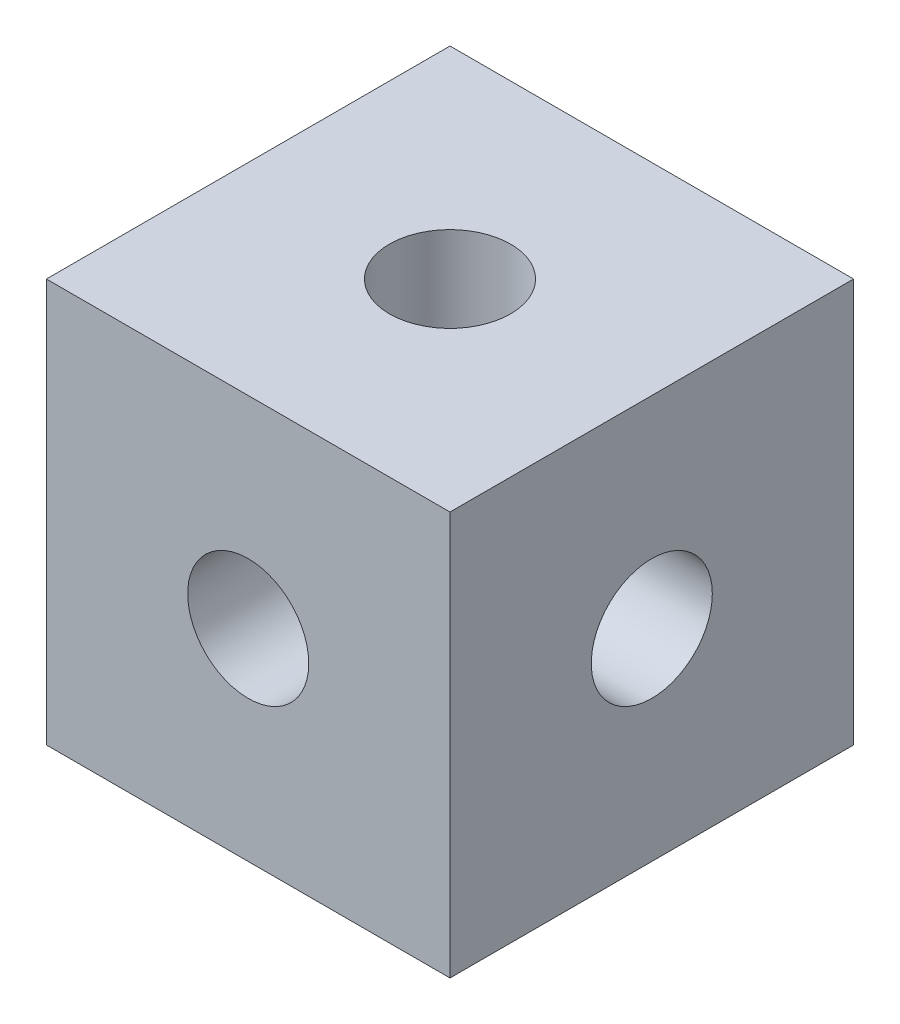
ISO-10303-21;
HEADER;
FILE_DESCRIPTION(('STEP AP214'),'2;1');
FILE_NAME('part.step','',(''),(''),'','','');
FILE_SCHEMA(('AUTOMOTIVE_DESIGN { 1 0 10303 214 1 1 1 1 }'));
ENDSEC;
DATA;
#1=APPLICATION_CONTEXT('core data for automotive mechanical design processes');
#2=APPLICATION_PROTOCOL_DEFINITION('international standard','automotive_design',2000,#1);
#3=PRODUCT_CONTEXT('',#1,'mechanical');
#4=PRODUCT('Part','Part','',(#3));
#5=PRODUCT_RELATED_PRODUCT_CATEGORY('part','',(#4));
#6=PRODUCT_DEFINITION_FORMATION('','',#4);
#7=PRODUCT_DEFINITION_CONTEXT('part definition',#1,'design');
#8=PRODUCT_DEFINITION('design','',#6,#7);
#9=PRODUCT_DEFINITION_SHAPE('','',#8);
#10=(LENGTH_UNIT() NAMED_UNIT(*) SI_UNIT(.MILLI.,.METRE.));
#11=(NAMED_UNIT(*) PLANE_ANGLE_UNIT() SI_UNIT($,.RADIAN.));
#12=(NAMED_UNIT(*) SI_UNIT($,.STERADIAN.) SOLID_ANGLE_UNIT());
#13=UNCERTAINTY_MEASURE_WITH_UNIT(LENGTH_MEASURE(1.E-05),#10,'distance_accuracy_value','');
#14=(GEOMETRIC_REPRESENTATION_CONTEXT(3) GLOBAL_UNCERTAINTY_ASSIGNED_CONTEXT((#13)) GLOBAL_UNIT_ASSIGNED_CONTEXT((#10,
#11,#12)) REPRESENTATION_CONTEXT('',''));
#15=CARTESIAN_POINT('',(0.,0.,0.));
#16=DIRECTION('',(0.,0.,1.));
#17=DIRECTION('',(1.,0.,0.));
#18=AXIS2_PLACEMENT_3D('',#15,#16,#17);
#19=CARTESIAN_POINT('',(5.,-2.,-5.));
#20=DIRECTION('',(0.,1.,0.));
#21=DIRECTION('',(0.,0.,1.));
#22=AXIS2_PLACEMENT_3D('',#19,#20,#21);
#23=CYLINDRICAL_SURFACE('',#22,1.5);
#24=CARTESIAN_POINT('',(5.,10.,-5.));
#25=DIRECTION('',(0.,1.,0.));
#26=DIRECTION('',(0.,0.,1.));
#27=AXIS2_PLACEMENT_3D('',#24,#25,#26);
#28=CIRCLE('',#27,1.5);
#29=CARTESIAN_POINT('',(5.,10.,-3.5));
#30=VERTEX_POINT('',#29);
#31=EDGE_CURVE('E185',#30,#30,#28,.T.);
#32=ORIENTED_EDGE('',*,*,#31,.T.);
#33=EDGE_LOOP('',(#32));
#34=FACE_BOUND('',#33,.T.);
#35=CARTESIAN_POINT('',(5.,5.,-5.));
#36=DIRECTION('',(0.,0.707106781186547,-0.707106781186547));
#37=DIRECTION('',(0.,0.707106781186547,0.707106781186547));
#38=AXIS2_PLACEMENT_3D('',#35,#36,#37);
#39=ELLIPSE('',#38,2.12132034355964,1.5);
#40=CARTESIAN_POINT('',(6.06066017177982,6.06066017177982,-3.93933982822017));
#41=VERTEX_POINT('',#40);
#42=CARTESIAN_POINT('',(3.93933982822018,6.06066017177982,-3.93933982822018));
#43=VERTEX_POINT('',#42);
#44=EDGE_CURVE('E121',#41,#43,#39,.F.);
#45=ORIENTED_EDGE('',*,*,#44,.T.);
#46=CARTESIAN_POINT('',(5.,5.,-5.));
#47=DIRECTION('',(0.707106781186547,0.707106781186547,0.));
#48=DIRECTION('',(-0.707106781186547,0.707106781186547,0.));
#49=AXIS2_PLACEMENT_3D('',#46,#47,#48);
#50=ELLIPSE('',#49,2.12132034355964,1.5);
#51=CARTESIAN_POINT('',(3.93933982822018,6.06066017177982,-6.06066017177982));
#52=VERTEX_POINT('',#51);
#53=EDGE_CURVE('E109',#43,#52,#50,.F.);
#54=ORIENTED_EDGE('',*,*,#53,.T.);
#55=CARTESIAN_POINT('',(5.,5.,-5.));
#56=DIRECTION('',(0.,0.707106781186547,0.707106781186547));
#57=DIRECTION('',(0.,0.707106781186547,-0.707106781186547));
#58=AXIS2_PLACEMENT_3D('',#55,#56,#57);
#59=ELLIPSE('',#58,2.12132034355964,1.5);
#60=CARTESIAN_POINT('',(6.06066017177982,6.06066017177982,-6.06066017177982));
#61=VERTEX_POINT('',#60);
#62=EDGE_CURVE('E116',#52,#61,#59,.F.);
#63=ORIENTED_EDGE('',*,*,#62,.T.);
#64=CARTESIAN_POINT('',(5.,5.,-5.));
#65=DIRECTION('',(-0.707106781186547,0.707106781186547,0.));
#66=DIRECTION('',(0.707106781186547,0.707106781186547,0.));
#67=AXIS2_PLACEMENT_3D('',#64,#65,#66);
#68=ELLIPSE('',#67,2.12132034355964,1.5);
#69=EDGE_CURVE('E61',#61,#41,#68,.F.);
#70=ORIENTED_EDGE('',*,*,#69,.T.);
#71=EDGE_LOOP('',(#45,#54,#63,#70));
#72=FACE_BOUND('',#71,.T.);
#73=ADVANCED_FACE('F45',(#34,#72),#23,.F.);
#74=CARTESIAN_POINT('',(10.,0.,0.));
#75=DIRECTION('',(0.,0.,-1.));
#76=DIRECTION('',(0.,1.,0.));
#77=AXIS2_PLACEMENT_3D('',#74,#75,#76);
#78=PLANE('',#77);
#79=CARTESIAN_POINT('',(5.,5.,0.));
#80=DIRECTION('',(0.,0.,1.));
#81=DIRECTION('',(1.,0.,0.));
#82=AXIS2_PLACEMENT_3D('',#79,#80,#81);
#83=CIRCLE('',#82,1.5);
#84=CARTESIAN_POINT('',(6.5,5.,0.));
#85=VERTEX_POINT('',#84);
#86=EDGE_CURVE('E193',#85,#85,#83,.T.);
#87=ORIENTED_EDGE('',*,*,#86,.F.);
#88=EDGE_LOOP('',(#87));
#89=FACE_BOUND('',#88,.T.);
#90=DIRECTION('',(0.,-1.,0.));
#91=VECTOR('',#90,1.);
#92=CARTESIAN_POINT('',(0.,0.,0.));
#93=LINE('',#92,#91);
#94=CARTESIAN_POINT('',(0.,10.,0.));
#95=VERTEX_POINT('',#94);
#96=CARTESIAN_POINT('',(0.,0.,0.));
#97=VERTEX_POINT('',#96);
#98=EDGE_CURVE('E166',#95,#97,#93,.T.);
#99=ORIENTED_EDGE('',*,*,#98,.T.);
#100=DIRECTION('',(-1.,0.,0.));
#101=VECTOR('',#100,1.);
#102=CARTESIAN_POINT('',(10.,0.,0.));
#103=LINE('',#102,#101);
#104=CARTESIAN_POINT('',(10.,0.,0.));
#105=VERTEX_POINT('',#104);
#106=EDGE_CURVE('E139',#105,#97,#103,.T.);
#107=ORIENTED_EDGE('',*,*,#106,.F.);
#108=DIRECTION('',(0.,-1.,0.));
#109=VECTOR('',#108,1.);
#110=CARTESIAN_POINT('',(10.,0.,0.));
#111=LINE('',#110,#109);
#112=CARTESIAN_POINT('',(10.,10.,0.));
#113=VERTEX_POINT('',#112);
#114=EDGE_CURVE('E159',#113,#105,#111,.T.);
#115=ORIENTED_EDGE('',*,*,#114,.F.);
#116=DIRECTION('',(-1.,0.,0.));
#117=VECTOR('',#116,1.);
#118=CARTESIAN_POINT('',(10.,10.,0.));
#119=LINE('',#118,#117);
#120=EDGE_CURVE('E151',#113,#95,#119,.T.);
#121=ORIENTED_EDGE('',*,*,#120,.T.);
#122=EDGE_LOOP('',(#99,#107,#115,#121));
#123=FACE_BOUND('',#122,.T.);
#124=ADVANCED_FACE('F47',(#89,#123),#78,.F.);
#125=CARTESIAN_POINT('',(10.,0.,0.));
#126=DIRECTION('',(0.,1.,0.));
#127=DIRECTION('',(0.,0.,1.));
#128=AXIS2_PLACEMENT_3D('',#125,#126,#127);
#129=PLANE('',#128);
#130=CARTESIAN_POINT('',(5.,0.,-5.));
#131=DIRECTION('',(0.,1.,0.));
#132=DIRECTION('',(0.,0.,1.));
#133=AXIS2_PLACEMENT_3D('',#130,#131,#132);
#134=CIRCLE('',#133,1.5);
#135=CARTESIAN_POINT('',(5.,0.,-3.5));
#136=VERTEX_POINT('',#135);
#137=EDGE_CURVE('E170',#136,#136,#134,.T.);
#138=ORIENTED_EDGE('',*,*,#137,.T.);
#139=EDGE_LOOP('',(#138));
#140=FACE_BOUND('',#139,.T.);
#141=DIRECTION('',(0.,0.,-1.));
#142=VECTOR('',#141,1.);
#143=CARTESIAN_POINT('',(0.,0.,0.));
#144=LINE('',#143,#142);
#145=CARTESIAN_POINT('',(0.,0.,-10.));
#146=VERTEX_POINT('',#145);
#147=EDGE_CURVE('E163',#97,#146,#144,.T.);
#148=ORIENTED_EDGE('',*,*,#147,.T.);
#149=DIRECTION('',(-1.,0.,0.));
#150=VECTOR('',#149,1.);
#151=CARTESIAN_POINT('',(10.,0.,-10.));
#152=LINE('',#151,#150);
#153=CARTESIAN_POINT('',(10.,0.,-10.));
#154=VERTEX_POINT('',#153);
#155=EDGE_CURVE('E143',#154,#146,#152,.T.);
#156=ORIENTED_EDGE('',*,*,#155,.F.);
#157=DIRECTION('',(0.,0.,-1.));
#158=VECTOR('',#157,1.);
#159=CARTESIAN_POINT('',(10.,0.,0.));
#160=LINE('',#159,#158);
#161=EDGE_CURVE('E176',#105,#154,#160,.T.);
#162=ORIENTED_EDGE('',*,*,#161,.F.);
#163=ORIENTED_EDGE('',*,*,#106,.T.);
#164=EDGE_LOOP('',(#148,#156,#162,#163));
#165=FACE_BOUND('',#164,.T.);
#166=ADVANCED_FACE('F236',(#140,#165),#129,.F.);
#167=CARTESIAN_POINT('',(10.,0.,-10.));
#168=DIRECTION('',(0.,0.,1.));
#169=DIRECTION('',(0.,-1.,0.));
#170=AXIS2_PLACEMENT_3D('',#167,#168,#169);
#171=PLANE('',#170);
#172=CARTESIAN_POINT('',(5.,5.,-10.));
#173=DIRECTION('',(0.,0.,1.));
#174=DIRECTION('',(0.,-1.,0.));
#175=AXIS2_PLACEMENT_3D('',#172,#173,#174);
#176=CIRCLE('',#175,1.5);
#177=CARTESIAN_POINT('',(5.,3.5,-10.));
#178=VERTEX_POINT('',#177);
#179=EDGE_CURVE('E189',#178,#178,#176,.T.);
#180=ORIENTED_EDGE('',*,*,#179,.T.);
#181=EDGE_LOOP('',(#180));
#182=FACE_BOUND('',#181,.T.);
#183=DIRECTION('',(0.,1.,0.));
#184=VECTOR('',#183,1.);
#185=CARTESIAN_POINT('',(0.,0.,-10.));
#186=LINE('',#185,#184);
#187=CARTESIAN_POINT('',(0.,10.,-9.99999999999999));
#188=VERTEX_POINT('',#187);
#189=EDGE_CURVE('E160',#146,#188,#186,.T.);
#190=ORIENTED_EDGE('',*,*,#189,.T.);
#191=DIRECTION('',(-1.,0.,0.));
#192=VECTOR('',#191,1.);
#193=CARTESIAN_POINT('',(10.,10.,-9.99999999999999));
#194=LINE('',#193,#192);
#195=CARTESIAN_POINT('',(10.,10.,-9.99999999999999));
#196=VERTEX_POINT('',#195);
#197=EDGE_CURVE('E147',#196,#188,#194,.T.);
#198=ORIENTED_EDGE('',*,*,#197,.F.);
#199=DIRECTION('',(0.,1.,0.));
#200=VECTOR('',#199,1.);
#201=CARTESIAN_POINT('',(10.,0.,-10.));
#202=LINE('',#201,#200);
#203=EDGE_CURVE('E173',#154,#196,#202,.T.);
#204=ORIENTED_EDGE('',*,*,#203,.F.);
#205=ORIENTED_EDGE('',*,*,#155,.T.);
#206=EDGE_LOOP('',(#190,#198,#204,#205));
#207=FACE_BOUND('',#206,.T.);
#208=ADVANCED_FACE('F241',(#182,#207),#171,.F.);
#209=CARTESIAN_POINT('',(10.,10.,0.));
#210=DIRECTION('',(0.,-1.,0.));
#211=DIRECTION('',(0.,0.,-1.));
#212=AXIS2_PLACEMENT_3D('',#209,#210,#211);
#213=PLANE('',#212);
#214=ORIENTED_EDGE('',*,*,#31,.F.);
#215=EDGE_LOOP('',(#214));
#216=FACE_BOUND('',#215,.T.);
#217=DIRECTION('',(0.,0.,1.));
#218=VECTOR('',#217,1.);
#219=CARTESIAN_POINT('',(0.,10.,0.));
#220=LINE('',#219,#218);
#221=EDGE_CURVE('E156',#188,#95,#220,.T.);
#222=ORIENTED_EDGE('',*,*,#221,.T.);
#223=ORIENTED_EDGE('',*,*,#120,.F.);
#224=DIRECTION('',(0.,0.,1.));
#225=VECTOR('',#224,1.);
#226=CARTESIAN_POINT('',(10.,10.,0.));
#227=LINE('',#226,#225);
#228=EDGE_CURVE('E155',#196,#113,#227,.T.);
#229=ORIENTED_EDGE('',*,*,#228,.F.);
#230=ORIENTED_EDGE('',*,*,#197,.T.);
#231=EDGE_LOOP('',(#222,#223,#229,#230));
#232=FACE_BOUND('',#231,.T.);
#233=ADVANCED_FACE('F226',(#216,#232),#213,.F.);
#234=CARTESIAN_POINT('',(10.,0.,0.));
#235=DIRECTION('',(-1.,0.,0.));
#236=DIRECTION('',(0.,0.,1.));
#237=AXIS2_PLACEMENT_3D('',#234,#235,#236);
#238=PLANE('',#237);
#239=CARTESIAN_POINT('',(10.,5.,-5.));
#240=DIRECTION('',(1.,0.,0.));
#241=DIRECTION('',(0.,0.,-1.));
#242=AXIS2_PLACEMENT_3D('',#239,#240,#241);
#243=CIRCLE('',#242,1.5);
#244=CARTESIAN_POINT('',(10.,5.,-6.5));
#245=VERTEX_POINT('',#244);
#246=EDGE_CURVE('E215',#245,#245,#243,.T.);
#247=ORIENTED_EDGE('',*,*,#246,.F.);
#248=EDGE_LOOP('',(#247));
#249=FACE_BOUND('',#248,.T.);
#250=ORIENTED_EDGE('',*,*,#114,.T.);
#251=ORIENTED_EDGE('',*,*,#161,.T.);
#252=ORIENTED_EDGE('',*,*,#203,.T.);
#253=ORIENTED_EDGE('',*,*,#228,.T.);
#254=EDGE_LOOP('',(#250,#251,#252,#253));
#255=FACE_BOUND('',#254,.T.);
#256=ADVANCED_FACE('F222',(#249,#255),#238,.F.);
#257=CARTESIAN_POINT('',(0.,0.,0.));
#258=DIRECTION('',(-1.,0.,0.));
#259=DIRECTION('',(0.,0.,1.));
#260=AXIS2_PLACEMENT_3D('',#257,#258,#259);
#261=PLANE('',#260);
#262=CARTESIAN_POINT('',(0.,5.,-5.));
#263=DIRECTION('',(-1.,0.,0.));
#264=DIRECTION('',(0.,0.,1.));
#265=AXIS2_PLACEMENT_3D('',#262,#263,#264);
#266=CIRCLE('',#265,1.5);
#267=CARTESIAN_POINT('',(0.,5.,-3.5));
#268=VERTEX_POINT('',#267);
#269=EDGE_CURVE('E197',#268,#268,#266,.T.);
#270=ORIENTED_EDGE('',*,*,#269,.F.);
#271=EDGE_LOOP('',(#270));
#272=FACE_BOUND('',#271,.T.);
#273=ORIENTED_EDGE('',*,*,#98,.F.);
#274=ORIENTED_EDGE('',*,*,#221,.F.);
#275=ORIENTED_EDGE('',*,*,#189,.F.);
#276=ORIENTED_EDGE('',*,*,#147,.F.);
#277=EDGE_LOOP('',(#273,#274,#275,#276));
#278=FACE_BOUND('',#277,.T.);
#279=ADVANCED_FACE('F225',(#272,#278),#261,.T.);
#280=CARTESIAN_POINT('',(5.,5.,-5.));
#281=DIRECTION('',(0.,0.707106781186547,0.707106781186547));
#282=DIRECTION('',(0.,0.707106781186547,-0.707106781186547));
#283=AXIS2_PLACEMENT_3D('',#280,#281,#282);
#284=ELLIPSE('',#283,2.12132034355964,1.5);
#285=CARTESIAN_POINT('',(3.93933982822018,3.93933982822018,-3.93933982822018));
#286=VERTEX_POINT('',#285);
#287=CARTESIAN_POINT('',(6.06066017177982,3.93933982822018,-3.93933982822018));
#288=VERTEX_POINT('',#287);
#289=EDGE_CURVE('E128',#286,#288,#284,.T.);
#290=ORIENTED_EDGE('',*,*,#289,.T.);
#291=CARTESIAN_POINT('',(5.,5.,-5.));
#292=DIRECTION('',(0.707106781186547,0.707106781186547,0.));
#293=DIRECTION('',(-0.707106781186547,0.707106781186547,0.));
#294=AXIS2_PLACEMENT_3D('',#291,#292,#293);
#295=ELLIPSE('',#294,2.12132034355964,1.5);
#296=CARTESIAN_POINT('',(6.06066017177982,3.93933982822018,-6.06066017177982));
#297=VERTEX_POINT('',#296);
#298=EDGE_CURVE('E207',#288,#297,#295,.T.);
#299=ORIENTED_EDGE('',*,*,#298,.T.);
#300=CARTESIAN_POINT('',(5.,5.,-5.));
#301=DIRECTION('',(0.,0.707106781186547,-0.707106781186547));
#302=DIRECTION('',(0.,0.707106781186547,0.707106781186547));
#303=AXIS2_PLACEMENT_3D('',#300,#301,#302);
#304=ELLIPSE('',#303,2.12132034355964,1.5);
#305=CARTESIAN_POINT('',(3.93933982822018,3.93933982822018,-6.06066017177982));
#306=VERTEX_POINT('',#305);
#307=EDGE_CURVE('E132',#297,#306,#304,.T.);
#308=ORIENTED_EDGE('',*,*,#307,.T.);
#309=CARTESIAN_POINT('',(5.,5.,-5.));
#310=DIRECTION('',(-0.707106781186547,0.707106781186547,0.));
#311=DIRECTION('',(0.707106781186547,0.707106781186547,0.));
#312=AXIS2_PLACEMENT_3D('',#309,#310,#311);
#313=ELLIPSE('',#312,2.12132034355964,1.5);
#314=EDGE_CURVE('E68',#306,#286,#313,.T.);
#315=ORIENTED_EDGE('',*,*,#314,.T.);
#316=EDGE_LOOP('',(#290,#299,#308,#315));
#317=FACE_BOUND('',#316,.T.);
#318=ORIENTED_EDGE('',*,*,#137,.F.);
#319=EDGE_LOOP('',(#318));
#320=FACE_BOUND('',#319,.T.);
#321=ADVANCED_FACE('F246',(#317,#320),#23,.F.);
#322=CARTESIAN_POINT('',(5.,5.,-12.));
#323=DIRECTION('',(0.,0.,1.));
#324=DIRECTION('',(1.,0.,0.));
#325=AXIS2_PLACEMENT_3D('',#322,#323,#324);
#326=CYLINDRICAL_SURFACE('',#325,1.5);
#327=ORIENTED_EDGE('',*,*,#86,.T.);
#328=EDGE_LOOP('',(#327));
#329=FACE_BOUND('',#328,.T.);
#330=ORIENTED_EDGE('',*,*,#289,.F.);
#331=CARTESIAN_POINT('',(5.,5.,-5.));
#332=DIRECTION('',(0.707106781186547,0.,0.707106781186547));
#333=DIRECTION('',(-0.707106781186547,0.,0.707106781186547));
#334=AXIS2_PLACEMENT_3D('',#331,#332,#333);
#335=ELLIPSE('',#334,2.12132034355964,1.5);
#336=EDGE_CURVE('E123',#286,#43,#335,.F.);
#337=ORIENTED_EDGE('',*,*,#336,.T.);
#338=ORIENTED_EDGE('',*,*,#44,.F.);
#339=CARTESIAN_POINT('',(5.,5.,-5.));
#340=DIRECTION('',(-0.707106781186547,0.,0.707106781186547));
#341=DIRECTION('',(0.707106781186547,0.,0.707106781186547));
#342=AXIS2_PLACEMENT_3D('',#339,#340,#341);
#343=ELLIPSE('',#342,2.12132034355964,1.5);
#344=EDGE_CURVE('E201',#41,#288,#343,.F.);
#345=ORIENTED_EDGE('',*,*,#344,.T.);
#346=EDGE_LOOP('',(#330,#337,#338,#345));
#347=FACE_BOUND('',#346,.T.);
#348=ADVANCED_FACE('F252',(#329,#347),#326,.F.);
#349=ORIENTED_EDGE('',*,*,#307,.F.);
#350=CARTESIAN_POINT('',(5.,5.,-5.));
#351=DIRECTION('',(0.707106781186547,0.,0.707106781186547));
#352=DIRECTION('',(-0.707106781186547,0.,0.707106781186547));
#353=AXIS2_PLACEMENT_3D('',#350,#351,#352);
#354=ELLIPSE('',#353,2.12132034355964,1.5);
#355=EDGE_CURVE('E11',#297,#61,#354,.T.);
#356=ORIENTED_EDGE('',*,*,#355,.T.);
#357=ORIENTED_EDGE('',*,*,#62,.F.);
#358=CARTESIAN_POINT('',(5.,5.,-5.));
#359=DIRECTION('',(-0.707106781186547,0.,0.707106781186547));
#360=DIRECTION('',(0.707106781186547,0.,0.707106781186547));
#361=AXIS2_PLACEMENT_3D('',#358,#359,#360);
#362=ELLIPSE('',#361,2.12132034355964,1.5);
#363=EDGE_CURVE('E54',#52,#306,#362,.T.);
#364=ORIENTED_EDGE('',*,*,#363,.T.);
#365=EDGE_LOOP('',(#349,#356,#357,#364));
#366=FACE_BOUND('',#365,.T.);
#367=ORIENTED_EDGE('',*,*,#179,.F.);
#368=EDGE_LOOP('',(#367));
#369=FACE_BOUND('',#368,.T.);
#370=ADVANCED_FACE('F125',(#366,#369),#326,.F.);
#371=CARTESIAN_POINT('',(-0.999999999999999,5.,-5.));
#372=DIRECTION('',(1.,0.,0.));
#373=DIRECTION('',(0.,0.,-1.));
#374=AXIS2_PLACEMENT_3D('',#371,#372,#373);
#375=CYLINDRICAL_SURFACE('',#374,1.5);
#376=ORIENTED_EDGE('',*,*,#269,.T.);
#377=EDGE_LOOP('',(#376));
#378=FACE_BOUND('',#377,.T.);
#379=ORIENTED_EDGE('',*,*,#314,.F.);
#380=ORIENTED_EDGE('',*,*,#363,.F.);
#381=ORIENTED_EDGE('',*,*,#53,.F.);
#382=ORIENTED_EDGE('',*,*,#336,.F.);
#383=EDGE_LOOP('',(#379,#380,#381,#382));
#384=FACE_BOUND('',#383,.T.);
#385=ADVANCED_FACE('F108',(#378,#384),#375,.F.);
#386=ORIENTED_EDGE('',*,*,#246,.T.);
#387=EDGE_LOOP('',(#386));
#388=FACE_BOUND('',#387,.T.);
#389=ORIENTED_EDGE('',*,*,#69,.F.);
#390=ORIENTED_EDGE('',*,*,#355,.F.);
#391=ORIENTED_EDGE('',*,*,#298,.F.);
#392=ORIENTED_EDGE('',*,*,#344,.F.);
#393=EDGE_LOOP('',(#389,#390,#391,#392));
#394=FACE_BOUND('',#393,.T.);
#395=ADVANCED_FACE('F220',(#388,#394),#375,.F.);
#396=CLOSED_SHELL('',(#73,#124,#166,#208,#233,#256,#279,#321,#348,#370,#385,#395));
#397=MANIFOLD_SOLID_BREP('B2',#396);
#398=ADVANCED_BREP_SHAPE_REPRESENTATION('',(#18,#397),#14);
#399=SHAPE_DEFINITION_REPRESENTATION(#9,#398);
ENDSEC;
END-ISO-10303-21;
